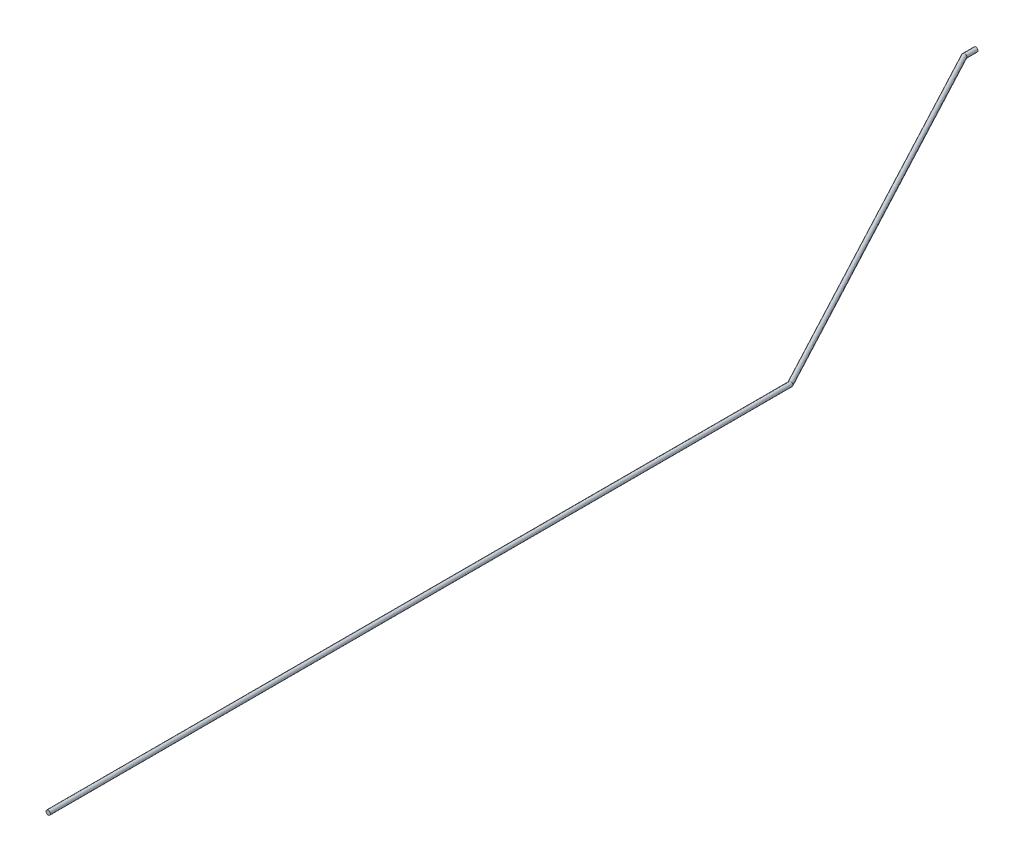
ISO-10303-21;
HEADER;
FILE_DESCRIPTION(('STEP AP214'),'2;1');
FILE_NAME('part.step','',(''),(''),'','','');
FILE_SCHEMA(('AUTOMOTIVE_DESIGN { 1 0 10303 214 1 1 1 1 }'));
ENDSEC;
DATA;
#1=APPLICATION_CONTEXT('core data for automotive mechanical design processes');
#2=APPLICATION_PROTOCOL_DEFINITION('international standard','automotive_design',2000,#1);
#3=PRODUCT_CONTEXT('',#1,'mechanical');
#4=PRODUCT('Part','Part','',(#3));
#5=PRODUCT_RELATED_PRODUCT_CATEGORY('part','',(#4));
#6=PRODUCT_DEFINITION_FORMATION('','',#4);
#7=PRODUCT_DEFINITION_CONTEXT('part definition',#1,'design');
#8=PRODUCT_DEFINITION('design','',#6,#7);
#9=PRODUCT_DEFINITION_SHAPE('','',#8);
#10=(LENGTH_UNIT() NAMED_UNIT(*) SI_UNIT(.MILLI.,.METRE.));
#11=(NAMED_UNIT(*) PLANE_ANGLE_UNIT() SI_UNIT($,.RADIAN.));
#12=(NAMED_UNIT(*) SI_UNIT($,.STERADIAN.) SOLID_ANGLE_UNIT());
#13=UNCERTAINTY_MEASURE_WITH_UNIT(LENGTH_MEASURE(1.E-05),#10,'distance_accuracy_value','');
#14=(GEOMETRIC_REPRESENTATION_CONTEXT(3) GLOBAL_UNCERTAINTY_ASSIGNED_CONTEXT((#13)) GLOBAL_UNIT_ASSIGNED_CONTEXT((#10,
#11,#12)) REPRESENTATION_CONTEXT('',''));
#15=CARTESIAN_POINT('',(0.,0.,0.));
#16=DIRECTION('',(0.,0.,1.));
#17=DIRECTION('',(1.,0.,0.));
#18=AXIS2_PLACEMENT_3D('',#15,#16,#17);
#19=CARTESIAN_POINT('',(0.,0.,0.));
#20=DIRECTION('',(0.,0.,1.));
#21=DIRECTION('',(1.,0.,0.));
#22=AXIS2_PLACEMENT_3D('',#19,#20,#21);
#23=PLANE('',#22);
#24=CARTESIAN_POINT('',(0.,0.,0.));
#25=DIRECTION('',(0.,0.,1.));
#26=DIRECTION('',(1.,0.,0.));
#27=AXIS2_PLACEMENT_3D('',#24,#25,#26);
#28=CIRCLE('',#27,2.38125);
#29=CARTESIAN_POINT('',(2.38125,0.,0.));
#30=VERTEX_POINT('',#29);
#31=EDGE_CURVE('E40',#30,#30,#28,.T.);
#32=ORIENTED_EDGE('',*,*,#31,.T.);
#33=EDGE_LOOP('',(#32));
#34=FACE_BOUND('',#33,.T.);
#35=ADVANCED_FACE('F37',(#34),#23,.T.);
#36=CARTESIAN_POINT('',(-215.9,0.,-1231.9));
#37=DIRECTION('',(0.,0.,1.));
#38=DIRECTION('',(1.,0.,0.));
#39=AXIS2_PLACEMENT_3D('',#36,#37,#38);
#40=PLANE('',#39);
#41=CARTESIAN_POINT('',(-215.9,0.,-1231.9));
#42=DIRECTION('',(0.,0.,1.));
#43=DIRECTION('',(1.,0.,0.));
#44=AXIS2_PLACEMENT_3D('',#41,#42,#43);
#45=CIRCLE('',#44,2.38125);
#46=CARTESIAN_POINT('',(-213.51875,0.,-1231.9));
#47=VERTEX_POINT('',#46);
#48=EDGE_CURVE('E44',#47,#47,#45,.T.);
#49=ORIENTED_EDGE('',*,*,#48,.F.);
#50=EDGE_LOOP('',(#49));
#51=FACE_BOUND('',#50,.T.);
#52=ADVANCED_FACE('F61',(#51),#40,.F.);
#53=CARTESIAN_POINT('',(0.,0.,-813.552585211469));
#54=DIRECTION('',(0.,0.,1.));
#55=DIRECTION('',(1.,0.,0.));
#56=AXIS2_PLACEMENT_3D('',#53,#54,#55);
#57=CYLINDRICAL_SURFACE('',#56,2.38125);
#58=CARTESIAN_POINT('',(0.,0.,-812.8));
#59=DIRECTION('',(0.24174809259081,0.,0.970339043700039));
#60=DIRECTION('',(0.970339043700039,0.,-0.24174809259081));
#61=AXIS2_PLACEMENT_3D('',#58,#59,#60);
#62=ELLIPSE('',#61,2.454039147925,2.38125);
#63=CARTESIAN_POINT('',(2.38124999999997,0.,-813.393259283154));
#64=VERTEX_POINT('',#63);
#65=EDGE_CURVE('E49',#64,#64,#62,.F.);
#66=ORIENTED_EDGE('',*,*,#65,.F.);
#67=EDGE_LOOP('',(#66));
#68=FACE_BOUND('',#67,.T.);
#69=ORIENTED_EDGE('',*,*,#31,.F.);
#70=EDGE_LOOP('',(#69));
#71=FACE_BOUND('',#70,.T.);
#72=ADVANCED_FACE('F58',(#68,#71),#57,.T.);
#73=CARTESIAN_POINT('',(-216.253079284942,0.,-1219.86461983048));
#74=DIRECTION('',(0.469155225961749,0.,0.883115719457411));
#75=DIRECTION('',(0.883115719457411,0.,-0.469155225961749));
#76=AXIS2_PLACEMENT_3D('',#73,#74,#75);
#77=CYLINDRICAL_SURFACE('',#76,2.38125);
#78=CARTESIAN_POINT('',(-215.9,0.,-1219.2));
#79=DIRECTION('',(0.241748092590812,0.,0.970339043700038));
#80=DIRECTION('',(-0.970339043700038,0.,0.241748092590812));
#81=AXIS2_PLACEMENT_3D('',#78,#79,#80);
#82=ELLIPSE('',#81,2.454039147925,2.38125);
#83=CARTESIAN_POINT('',(-218.28125,0.,-1218.60674071685));
#84=VERTEX_POINT('',#83);
#85=EDGE_CURVE('E10',#84,#84,#82,.F.);
#86=ORIENTED_EDGE('',*,*,#85,.F.);
#87=EDGE_LOOP('',(#86));
#88=FACE_BOUND('',#87,.T.);
#89=ORIENTED_EDGE('',*,*,#65,.T.);
#90=EDGE_LOOP('',(#89));
#91=FACE_BOUND('',#90,.T.);
#92=ADVANCED_FACE('F60',(#88,#91),#77,.T.);
#93=CARTESIAN_POINT('',(-215.9,0.,-1231.9));
#94=DIRECTION('',(0.,0.,1.));
#95=DIRECTION('',(1.,0.,0.));
#96=AXIS2_PLACEMENT_3D('',#93,#94,#95);
#97=CYLINDRICAL_SURFACE('',#96,2.38125);
#98=ORIENTED_EDGE('',*,*,#48,.T.);
#99=EDGE_LOOP('',(#98));
#100=FACE_BOUND('',#99,.T.);
#101=ORIENTED_EDGE('',*,*,#85,.T.);
#102=EDGE_LOOP('',(#101));
#103=FACE_BOUND('',#102,.T.);
#104=ADVANCED_FACE('F68',(#100,#103),#97,.T.);
#105=CLOSED_SHELL('',(#35,#52,#72,#92,#104));
#106=MANIFOLD_SOLID_BREP('B2',#105);
#107=ADVANCED_BREP_SHAPE_REPRESENTATION('',(#18,#106),#14);
#108=SHAPE_DEFINITION_REPRESENTATION(#9,#107);
ENDSEC;
END-ISO-10303-21;
